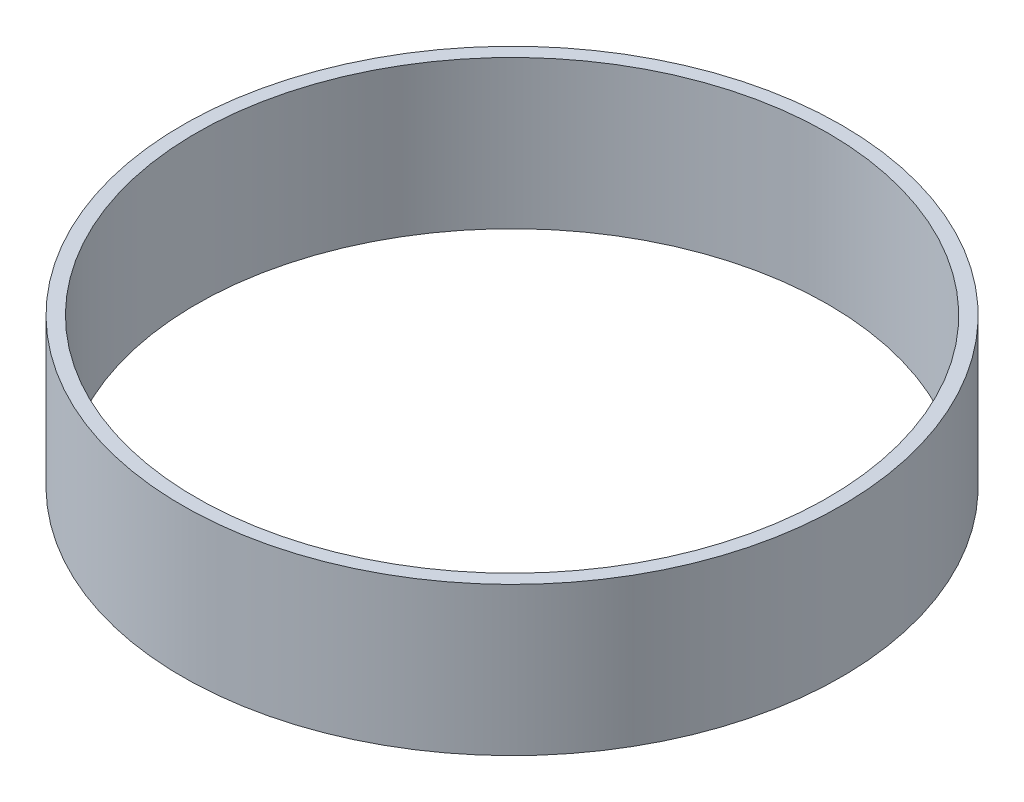
ISO-10303-21;
HEADER;
FILE_DESCRIPTION(('STEP AP214'),'2;1');
FILE_NAME('part.step','',(''),(''),'','','');
FILE_SCHEMA(('AUTOMOTIVE_DESIGN { 1 0 10303 214 1 1 1 1 }'));
ENDSEC;
DATA;
#1=APPLICATION_CONTEXT('core data for automotive mechanical design processes');
#2=APPLICATION_PROTOCOL_DEFINITION('international standard','automotive_design',2000,#1);
#3=PRODUCT_CONTEXT('',#1,'mechanical');
#4=PRODUCT('Part','Part','',(#3));
#5=PRODUCT_RELATED_PRODUCT_CATEGORY('part','',(#4));
#6=PRODUCT_DEFINITION_FORMATION('','',#4);
#7=PRODUCT_DEFINITION_CONTEXT('part definition',#1,'design');
#8=PRODUCT_DEFINITION('design','',#6,#7);
#9=PRODUCT_DEFINITION_SHAPE('','',#8);
#10=(LENGTH_UNIT() NAMED_UNIT(*) SI_UNIT(.MILLI.,.METRE.));
#11=(NAMED_UNIT(*) PLANE_ANGLE_UNIT() SI_UNIT($,.RADIAN.));
#12=(NAMED_UNIT(*) SI_UNIT($,.STERADIAN.) SOLID_ANGLE_UNIT());
#13=UNCERTAINTY_MEASURE_WITH_UNIT(LENGTH_MEASURE(1.E-05),#10,'distance_accuracy_value','');
#14=(GEOMETRIC_REPRESENTATION_CONTEXT(3) GLOBAL_UNCERTAINTY_ASSIGNED_CONTEXT((#13)) GLOBAL_UNIT_ASSIGNED_CONTEXT((#10,
#11,#12)) REPRESENTATION_CONTEXT('',''));
#15=CARTESIAN_POINT('',(0.,0.,0.));
#16=DIRECTION('',(0.,0.,1.));
#17=DIRECTION('',(1.,0.,0.));
#18=AXIS2_PLACEMENT_3D('',#15,#16,#17);
#19=CARTESIAN_POINT('',(0.,-26.91,0.));
#20=DIRECTION('',(0.,-1.,0.));
#21=DIRECTION('',(0.,0.,-1.));
#22=AXIS2_PLACEMENT_3D('',#19,#20,#21);
#23=PLANE('',#22);
#24=CARTESIAN_POINT('',(0.,-26.91,0.));
#25=DIRECTION('',(0.,-1.,0.));
#26=DIRECTION('',(0.,0.,-1.));
#27=AXIS2_PLACEMENT_3D('',#24,#25,#26);
#28=CIRCLE('',#27,60.);
#29=CARTESIAN_POINT('',(0.,-26.91,-60.));
#30=VERTEX_POINT('',#29);
#31=EDGE_CURVE('E10',#30,#30,#28,.T.);
#32=ORIENTED_EDGE('',*,*,#31,.T.);
#33=EDGE_LOOP('',(#32));
#34=FACE_BOUND('',#33,.T.);
#35=CARTESIAN_POINT('',(0.,-26.91,0.));
#36=DIRECTION('',(0.,-1.,0.));
#37=DIRECTION('',(0.,0.,-1.));
#38=AXIS2_PLACEMENT_3D('',#35,#36,#37);
#39=CIRCLE('',#38,57.5);
#40=CARTESIAN_POINT('',(0.,-26.91,-57.5));
#41=VERTEX_POINT('',#40);
#42=EDGE_CURVE('E42',#41,#41,#39,.T.);
#43=ORIENTED_EDGE('',*,*,#42,.F.);
#44=EDGE_LOOP('',(#43));
#45=FACE_BOUND('',#44,.T.);
#46=ADVANCED_FACE('F31',(#34,#45),#23,.T.);
#47=CARTESIAN_POINT('',(0.,0.09,0.));
#48=DIRECTION('',(0.,-1.,0.));
#49=DIRECTION('',(0.,0.,-1.));
#50=AXIS2_PLACEMENT_3D('',#47,#48,#49);
#51=PLANE('',#50);
#52=CARTESIAN_POINT('',(0.,0.09,0.));
#53=DIRECTION('',(0.,-1.,0.));
#54=DIRECTION('',(0.,0.,-1.));
#55=AXIS2_PLACEMENT_3D('',#52,#53,#54);
#56=CIRCLE('',#55,60.);
#57=CARTESIAN_POINT('',(0.,0.09,-60.));
#58=VERTEX_POINT('',#57);
#59=EDGE_CURVE('E35',#58,#58,#56,.T.);
#60=ORIENTED_EDGE('',*,*,#59,.F.);
#61=EDGE_LOOP('',(#60));
#62=FACE_BOUND('',#61,.T.);
#63=CARTESIAN_POINT('',(0.,0.09,0.));
#64=DIRECTION('',(0.,-1.,0.));
#65=DIRECTION('',(0.,0.,-1.));
#66=AXIS2_PLACEMENT_3D('',#63,#64,#65);
#67=CIRCLE('',#66,57.5);
#68=CARTESIAN_POINT('',(0.,0.09,-57.5));
#69=VERTEX_POINT('',#68);
#70=EDGE_CURVE('E44',#69,#69,#67,.T.);
#71=ORIENTED_EDGE('',*,*,#70,.T.);
#72=EDGE_LOOP('',(#71));
#73=FACE_BOUND('',#72,.T.);
#74=ADVANCED_FACE('F54',(#62,#73),#51,.F.);
#75=CARTESIAN_POINT('',(0.,-26.91,0.));
#76=DIRECTION('',(0.,1.,0.));
#77=DIRECTION('',(0.,0.,1.));
#78=AXIS2_PLACEMENT_3D('',#75,#76,#77);
#79=CYLINDRICAL_SURFACE('',#78,60.);
#80=ORIENTED_EDGE('',*,*,#31,.F.);
#81=EDGE_LOOP('',(#80));
#82=FACE_BOUND('',#81,.T.);
#83=ORIENTED_EDGE('',*,*,#59,.T.);
#84=EDGE_LOOP('',(#83));
#85=FACE_BOUND('',#84,.T.);
#86=ADVANCED_FACE('F33',(#82,#85),#79,.T.);
#87=CARTESIAN_POINT('',(0.,-26.91,0.));
#88=DIRECTION('',(0.,1.,0.));
#89=DIRECTION('',(0.,0.,1.));
#90=AXIS2_PLACEMENT_3D('',#87,#88,#89);
#91=CYLINDRICAL_SURFACE('',#90,57.5);
#92=ORIENTED_EDGE('',*,*,#42,.T.);
#93=EDGE_LOOP('',(#92));
#94=FACE_BOUND('',#93,.T.);
#95=ORIENTED_EDGE('',*,*,#70,.F.);
#96=EDGE_LOOP('',(#95));
#97=FACE_BOUND('',#96,.T.);
#98=ADVANCED_FACE('F50',(#94,#97),#91,.F.);
#99=CLOSED_SHELL('',(#46,#74,#86,#98));
#100=MANIFOLD_SOLID_BREP('B2',#99);
#101=ADVANCED_BREP_SHAPE_REPRESENTATION('',(#18,#100),#14);
#102=SHAPE_DEFINITION_REPRESENTATION(#9,#101);
ENDSEC;
END-ISO-10303-21;
